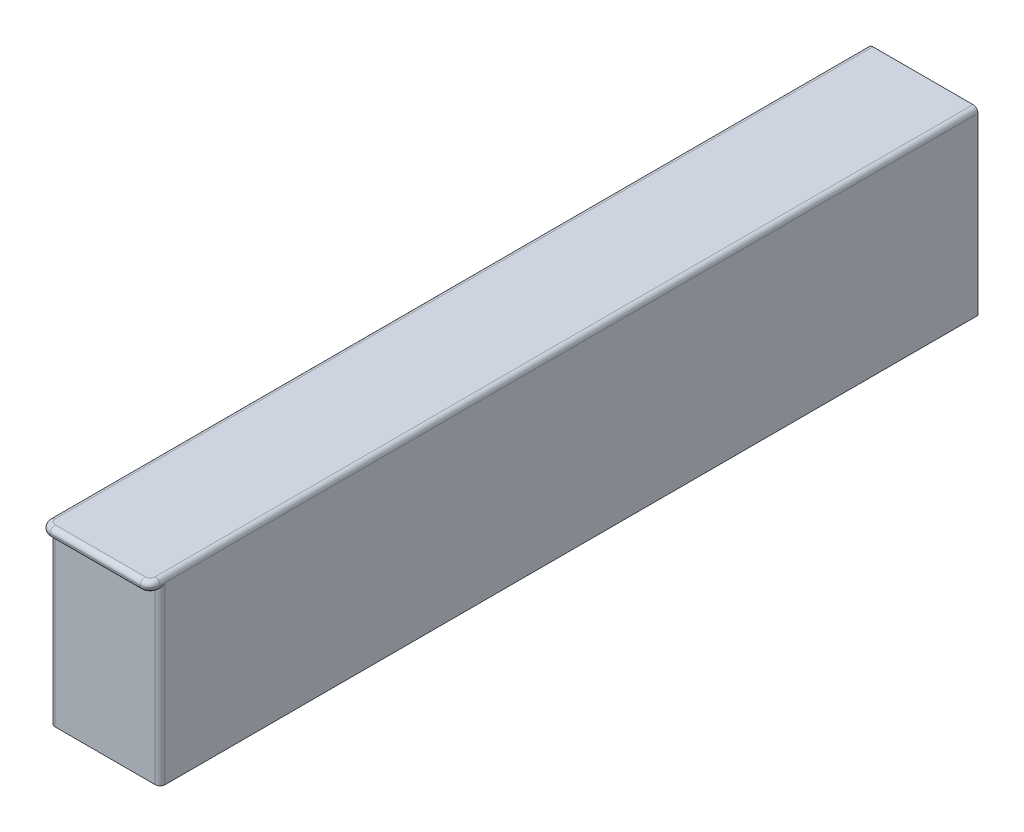
ISO-10303-21;
HEADER;
FILE_DESCRIPTION(('STEP AP214'),'2;1');
FILE_NAME('part.step','',(''),(''),'','','');
FILE_SCHEMA(('AUTOMOTIVE_DESIGN { 1 0 10303 214 1 1 1 1 }'));
ENDSEC;
DATA;
#1=APPLICATION_CONTEXT('core data for automotive mechanical design processes');
#2=APPLICATION_PROTOCOL_DEFINITION('international standard','automotive_design',2000,#1);
#3=PRODUCT_CONTEXT('',#1,'mechanical');
#4=PRODUCT('Part','Part','',(#3));
#5=PRODUCT_RELATED_PRODUCT_CATEGORY('part','',(#4));
#6=PRODUCT_DEFINITION_FORMATION('','',#4);
#7=PRODUCT_DEFINITION_CONTEXT('part definition',#1,'design');
#8=PRODUCT_DEFINITION('design','',#6,#7);
#9=PRODUCT_DEFINITION_SHAPE('','',#8);
#10=(LENGTH_UNIT() NAMED_UNIT(*) SI_UNIT(.MILLI.,.METRE.));
#11=(NAMED_UNIT(*) PLANE_ANGLE_UNIT() SI_UNIT($,.RADIAN.));
#12=(NAMED_UNIT(*) SI_UNIT($,.STERADIAN.) SOLID_ANGLE_UNIT());
#13=UNCERTAINTY_MEASURE_WITH_UNIT(LENGTH_MEASURE(1.E-05),#10,'distance_accuracy_value','');
#14=(GEOMETRIC_REPRESENTATION_CONTEXT(3) GLOBAL_UNCERTAINTY_ASSIGNED_CONTEXT((#13)) GLOBAL_UNIT_ASSIGNED_CONTEXT((#10,
#11,#12)) REPRESENTATION_CONTEXT('',''));
#15=CARTESIAN_POINT('',(0.,0.,0.));
#16=DIRECTION('',(0.,0.,1.));
#17=DIRECTION('',(1.,0.,0.));
#18=AXIS2_PLACEMENT_3D('',#15,#16,#17);
#19=CARTESIAN_POINT('',(-11.,36.,81.75));
#20=DIRECTION('',(0.,0.,-1.));
#21=DIRECTION('',(-1.,0.,0.));
#22=AXIS2_PLACEMENT_3D('',#19,#20,#21);
#23=PLANE('',#22);
#24=DIRECTION('',(1.,0.,0.));
#25=VECTOR('',#24,1.);
#26=CARTESIAN_POINT('',(-11.,34.,81.75));
#27=LINE('',#26,#25);
#28=CARTESIAN_POINT('',(-10.,34.,81.75));
#29=VERTEX_POINT('',#28);
#30=CARTESIAN_POINT('',(10.,34.,81.75));
#31=VERTEX_POINT('',#30);
#32=EDGE_CURVE('E225',#29,#31,#27,.T.);
#33=ORIENTED_EDGE('',*,*,#32,.F.);
#34=DIRECTION('',(0.,-1.,0.));
#35=VECTOR('',#34,1.);
#36=CARTESIAN_POINT('',(-10.,0.,81.75));
#37=LINE('',#36,#35);
#38=CARTESIAN_POINT('',(-10.,0.,81.75));
#39=VERTEX_POINT('',#38);
#40=EDGE_CURVE('E160',#29,#39,#37,.T.);
#41=ORIENTED_EDGE('',*,*,#40,.T.);
#42=DIRECTION('',(1.,0.,0.));
#43=VECTOR('',#42,1.);
#44=CARTESIAN_POINT('',(-11.,0.,81.75));
#45=LINE('',#44,#43);
#46=CARTESIAN_POINT('',(10.,0.,81.75));
#47=VERTEX_POINT('',#46);
#48=EDGE_CURVE('E226',#39,#47,#45,.T.);
#49=ORIENTED_EDGE('',*,*,#48,.T.);
#50=DIRECTION('',(0.,-1.,0.));
#51=VECTOR('',#50,1.);
#52=CARTESIAN_POINT('',(10.,36.,81.75));
#53=LINE('',#52,#51);
#54=EDGE_CURVE('E247',#47,#31,#53,.F.);
#55=ORIENTED_EDGE('',*,*,#54,.T.);
#56=EDGE_LOOP('',(#33,#41,#49,#55));
#57=FACE_BOUND('',#56,.T.);
#58=ADVANCED_FACE('F45',(#57),#23,.F.);
#59=CARTESIAN_POINT('',(-10.,36.,80.75));
#60=DIRECTION('',(0.,1.,0.));
#61=DIRECTION('',(0.,0.,1.));
#62=AXIS2_PLACEMENT_3D('',#59,#60,#61);
#63=CYLINDRICAL_SURFACE('',#62,1.);
#64=ORIENTED_EDGE('',*,*,#40,.F.);
#65=CARTESIAN_POINT('',(-10.,35.,80.75));
#66=DIRECTION('',(0.,-0.707106781186547,-0.707106781186547));
#67=DIRECTION('',(0.,0.707106781186547,-0.707106781186547));
#68=AXIS2_PLACEMENT_3D('',#65,#66,#67);
#69=ELLIPSE('',#68,1.41421356237309,1.);
#70=CARTESIAN_POINT('',(-11.,35.,80.75));
#71=VERTEX_POINT('',#70);
#72=EDGE_CURVE('E55',#29,#71,#69,.T.);
#73=ORIENTED_EDGE('',*,*,#72,.T.);
#74=DIRECTION('',(0.,-1.,0.));
#75=VECTOR('',#74,1.);
#76=CARTESIAN_POINT('',(-11.,36.,80.75));
#77=LINE('',#76,#75);
#78=CARTESIAN_POINT('',(-11.,0.,80.75));
#79=VERTEX_POINT('',#78);
#80=EDGE_CURVE('E145',#79,#71,#77,.F.);
#81=ORIENTED_EDGE('',*,*,#80,.F.);
#82=CARTESIAN_POINT('',(-10.,0.,80.75));
#83=DIRECTION('',(0.,1.,0.));
#84=DIRECTION('',(0.,0.,1.));
#85=AXIS2_PLACEMENT_3D('',#82,#83,#84);
#86=CIRCLE('',#85,1.);
#87=EDGE_CURVE('E156',#39,#79,#86,.F.);
#88=ORIENTED_EDGE('',*,*,#87,.F.);
#89=EDGE_LOOP('',(#64,#73,#81,#88));
#90=FACE_BOUND('',#89,.T.);
#91=ADVANCED_FACE('F159',(#90),#63,.T.);
#92=CARTESIAN_POINT('',(10.,36.,80.75));
#93=DIRECTION('',(0.,-1.,0.));
#94=DIRECTION('',(0.,0.,-1.));
#95=AXIS2_PLACEMENT_3D('',#92,#93,#94);
#96=CYLINDRICAL_SURFACE('',#95,1.);
#97=DIRECTION('',(0.,-1.,0.));
#98=VECTOR('',#97,1.);
#99=CARTESIAN_POINT('',(11.,36.,80.75));
#100=LINE('',#99,#98);
#101=CARTESIAN_POINT('',(11.,35.,80.75));
#102=VERTEX_POINT('',#101);
#103=CARTESIAN_POINT('',(11.,0.,80.75));
#104=VERTEX_POINT('',#103);
#105=EDGE_CURVE('E155',#102,#104,#100,.T.);
#106=ORIENTED_EDGE('',*,*,#105,.F.);
#107=CARTESIAN_POINT('',(10.,35.,80.75));
#108=DIRECTION('',(0.,-0.707106781186547,-0.707106781186547));
#109=DIRECTION('',(0.,0.707106781186547,-0.707106781186547));
#110=AXIS2_PLACEMENT_3D('',#107,#108,#109);
#111=ELLIPSE('',#110,1.41421356237309,1.);
#112=EDGE_CURVE('E11',#102,#31,#111,.T.);
#113=ORIENTED_EDGE('',*,*,#112,.T.);
#114=ORIENTED_EDGE('',*,*,#54,.F.);
#115=CARTESIAN_POINT('',(10.,0.,80.75));
#116=DIRECTION('',(0.,1.,0.));
#117=DIRECTION('',(0.,0.,1.));
#118=AXIS2_PLACEMENT_3D('',#115,#116,#117);
#119=CIRCLE('',#118,1.);
#120=EDGE_CURVE('E250',#104,#47,#119,.F.);
#121=ORIENTED_EDGE('',*,*,#120,.F.);
#122=EDGE_LOOP('',(#106,#113,#114,#121));
#123=FACE_BOUND('',#122,.T.);
#124=ADVANCED_FACE('F306',(#123),#96,.T.);
#125=CARTESIAN_POINT('',(11.,36.,81.75));
#126=DIRECTION('',(-1.,0.,0.));
#127=DIRECTION('',(0.,0.,1.));
#128=AXIS2_PLACEMENT_3D('',#125,#126,#127);
#129=PLANE('',#128);
#130=DIRECTION('',(0.,-1.,0.));
#131=VECTOR('',#130,1.);
#132=CARTESIAN_POINT('',(11.,36.,-81.75));
#133=LINE('',#132,#131);
#134=CARTESIAN_POINT('',(11.,35.,-81.75));
#135=VERTEX_POINT('',#134);
#136=CARTESIAN_POINT('',(11.,0.,-81.75));
#137=VERTEX_POINT('',#136);
#138=EDGE_CURVE('E245',#135,#137,#133,.T.);
#139=ORIENTED_EDGE('',*,*,#138,.F.);
#140=DIRECTION('',(0.,0.,-1.));
#141=VECTOR('',#140,1.);
#142=CARTESIAN_POINT('',(11.,35.,81.75));
#143=LINE('',#142,#141);
#144=EDGE_CURVE('E170',#135,#102,#143,.F.);
#145=ORIENTED_EDGE('',*,*,#144,.T.);
#146=ORIENTED_EDGE('',*,*,#105,.T.);
#147=DIRECTION('',(0.,0.,-1.));
#148=VECTOR('',#147,1.);
#149=CARTESIAN_POINT('',(11.,0.,81.75));
#150=LINE('',#149,#148);
#151=EDGE_CURVE('E231',#104,#137,#150,.T.);
#152=ORIENTED_EDGE('',*,*,#151,.T.);
#153=EDGE_LOOP('',(#139,#145,#146,#152));
#154=FACE_BOUND('',#153,.T.);
#155=ADVANCED_FACE('F272',(#154),#129,.F.);
#156=CARTESIAN_POINT('',(-11.,36.,-81.75));
#157=DIRECTION('',(0.,0.,-1.));
#158=DIRECTION('',(-1.,0.,0.));
#159=AXIS2_PLACEMENT_3D('',#156,#157,#158);
#160=PLANE('',#159);
#161=DIRECTION('',(1.,0.,0.));
#162=VECTOR('',#161,1.);
#163=CARTESIAN_POINT('',(-11.,36.,-81.75));
#164=LINE('',#163,#162);
#165=CARTESIAN_POINT('',(-10.,36.,-81.75));
#166=VERTEX_POINT('',#165);
#167=CARTESIAN_POINT('',(10.,36.,-81.75));
#168=VERTEX_POINT('',#167);
#169=EDGE_CURVE('E234',#166,#168,#164,.T.);
#170=ORIENTED_EDGE('',*,*,#169,.T.);
#171=CARTESIAN_POINT('',(10.,35.,-81.75));
#172=DIRECTION('',(0.,0.,-1.));
#173=DIRECTION('',(-1.,0.,0.));
#174=AXIS2_PLACEMENT_3D('',#171,#172,#173);
#175=CIRCLE('',#174,1.);
#176=EDGE_CURVE('E175',#168,#135,#175,.T.);
#177=ORIENTED_EDGE('',*,*,#176,.T.);
#178=ORIENTED_EDGE('',*,*,#138,.T.);
#179=DIRECTION('',(1.,0.,0.));
#180=VECTOR('',#179,1.);
#181=CARTESIAN_POINT('',(-11.,0.,-81.75));
#182=LINE('',#181,#180);
#183=CARTESIAN_POINT('',(-11.,0.,-81.75));
#184=VERTEX_POINT('',#183);
#185=EDGE_CURVE('E240',#184,#137,#182,.T.);
#186=ORIENTED_EDGE('',*,*,#185,.F.);
#187=DIRECTION('',(0.,-1.,0.));
#188=VECTOR('',#187,1.);
#189=CARTESIAN_POINT('',(-11.,36.,-81.75));
#190=LINE('',#189,#188);
#191=CARTESIAN_POINT('',(-11.,35.,-81.75));
#192=VERTEX_POINT('',#191);
#193=EDGE_CURVE('E236',#192,#184,#190,.T.);
#194=ORIENTED_EDGE('',*,*,#193,.F.);
#195=CARTESIAN_POINT('',(-10.,35.,-81.75));
#196=DIRECTION('',(0.,0.,-1.));
#197=DIRECTION('',(-1.,0.,0.));
#198=AXIS2_PLACEMENT_3D('',#195,#196,#197);
#199=CIRCLE('',#198,1.);
#200=EDGE_CURVE('E169',#192,#166,#199,.T.);
#201=ORIENTED_EDGE('',*,*,#200,.T.);
#202=EDGE_LOOP('',(#170,#177,#178,#186,#194,#201));
#203=FACE_BOUND('',#202,.T.);
#204=ADVANCED_FACE('F265',(#203),#160,.T.);
#205=CARTESIAN_POINT('',(-11.,36.,81.75));
#206=DIRECTION('',(-1.,0.,0.));
#207=DIRECTION('',(0.,0.,1.));
#208=AXIS2_PLACEMENT_3D('',#205,#206,#207);
#209=PLANE('',#208);
#210=ORIENTED_EDGE('',*,*,#80,.T.);
#211=DIRECTION('',(0.,0.,-1.));
#212=VECTOR('',#211,1.);
#213=CARTESIAN_POINT('',(-11.,35.,81.75));
#214=LINE('',#213,#212);
#215=EDGE_CURVE('E149',#71,#192,#214,.T.);
#216=ORIENTED_EDGE('',*,*,#215,.T.);
#217=ORIENTED_EDGE('',*,*,#193,.T.);
#218=DIRECTION('',(0.,0.,-1.));
#219=VECTOR('',#218,1.);
#220=CARTESIAN_POINT('',(-11.,0.,81.75));
#221=LINE('',#220,#219);
#222=EDGE_CURVE('E152',#79,#184,#221,.T.);
#223=ORIENTED_EDGE('',*,*,#222,.F.);
#224=EDGE_LOOP('',(#210,#216,#217,#223));
#225=FACE_BOUND('',#224,.T.);
#226=ADVANCED_FACE('F147',(#225),#209,.T.);
#227=CARTESIAN_POINT('',(0.,36.,0.));
#228=DIRECTION('',(0.,1.,0.));
#229=DIRECTION('',(0.,0.,1.));
#230=AXIS2_PLACEMENT_3D('',#227,#228,#229);
#231=PLANE('',#230);
#232=CARTESIAN_POINT('',(9.,36.,81.75));
#233=DIRECTION('',(0.,1.,0.));
#234=DIRECTION('',(0.,0.,1.));
#235=AXIS2_PLACEMENT_3D('',#232,#233,#234);
#236=CIRCLE('',#235,1.);
#237=CARTESIAN_POINT('',(9.,36.,82.75));
#238=VERTEX_POINT('',#237);
#239=CARTESIAN_POINT('',(10.,36.,81.75));
#240=VERTEX_POINT('',#239);
#241=EDGE_CURVE('E258',#238,#240,#236,.T.);
#242=ORIENTED_EDGE('',*,*,#241,.T.);
#243=DIRECTION('',(0.,0.,-1.));
#244=VECTOR('',#243,1.);
#245=CARTESIAN_POINT('',(10.,36.,-81.75));
#246=LINE('',#245,#244);
#247=EDGE_CURVE('E260',#240,#168,#246,.T.);
#248=ORIENTED_EDGE('',*,*,#247,.T.);
#249=ORIENTED_EDGE('',*,*,#169,.F.);
#250=DIRECTION('',(0.,0.,-1.));
#251=VECTOR('',#250,1.);
#252=CARTESIAN_POINT('',(-10.,36.,0.));
#253=LINE('',#252,#251);
#254=CARTESIAN_POINT('',(-10.,36.,81.75));
#255=VERTEX_POINT('',#254);
#256=EDGE_CURVE('E254',#166,#255,#253,.F.);
#257=ORIENTED_EDGE('',*,*,#256,.T.);
#258=CARTESIAN_POINT('',(-9.,36.,81.75));
#259=DIRECTION('',(0.,1.,0.));
#260=DIRECTION('',(0.,0.,1.));
#261=AXIS2_PLACEMENT_3D('',#258,#259,#260);
#262=CIRCLE('',#261,1.);
#263=CARTESIAN_POINT('',(-9.,36.,82.75));
#264=VERTEX_POINT('',#263);
#265=EDGE_CURVE('E223',#255,#264,#262,.T.);
#266=ORIENTED_EDGE('',*,*,#265,.T.);
#267=DIRECTION('',(1.,0.,0.));
#268=VECTOR('',#267,1.);
#269=CARTESIAN_POINT('',(0.,36.,82.75));
#270=LINE('',#269,#268);
#271=EDGE_CURVE('E219',#264,#238,#270,.T.);
#272=ORIENTED_EDGE('',*,*,#271,.T.);
#273=EDGE_LOOP('',(#242,#248,#249,#257,#266,#272));
#274=FACE_BOUND('',#273,.T.);
#275=ADVANCED_FACE('F286',(#274),#231,.T.);
#276=CARTESIAN_POINT('',(0.,0.,0.));
#277=DIRECTION('',(0.,1.,0.));
#278=DIRECTION('',(0.,0.,1.));
#279=AXIS2_PLACEMENT_3D('',#276,#277,#278);
#280=PLANE('',#279);
#281=ORIENTED_EDGE('',*,*,#48,.F.);
#282=ORIENTED_EDGE('',*,*,#87,.T.);
#283=ORIENTED_EDGE('',*,*,#222,.T.);
#284=ORIENTED_EDGE('',*,*,#185,.T.);
#285=ORIENTED_EDGE('',*,*,#151,.F.);
#286=ORIENTED_EDGE('',*,*,#120,.T.);
#287=EDGE_LOOP('',(#281,#282,#283,#284,#285,#286));
#288=FACE_BOUND('',#287,.T.);
#289=ADVANCED_FACE('F288',(#288),#280,.F.);
#290=CARTESIAN_POINT('',(0.,34.,0.));
#291=DIRECTION('',(0.,1.,0.));
#292=DIRECTION('',(0.,0.,1.));
#293=AXIS2_PLACEMENT_3D('',#290,#291,#292);
#294=PLANE('',#293);
#295=DIRECTION('',(1.,0.,0.));
#296=VECTOR('',#295,1.);
#297=CARTESIAN_POINT('',(-9.,34.,82.75));
#298=LINE('',#297,#296);
#299=CARTESIAN_POINT('',(9.,34.,82.75));
#300=VERTEX_POINT('',#299);
#301=CARTESIAN_POINT('',(-9.,34.,82.75));
#302=VERTEX_POINT('',#301);
#303=EDGE_CURVE('E64',#300,#302,#298,.F.);
#304=ORIENTED_EDGE('',*,*,#303,.T.);
#305=CARTESIAN_POINT('',(-9.,34.,81.75));
#306=DIRECTION('',(0.,1.,0.));
#307=DIRECTION('',(0.,0.,1.));
#308=AXIS2_PLACEMENT_3D('',#305,#306,#307);
#309=CIRCLE('',#308,1.);
#310=EDGE_CURVE('E161',#302,#29,#309,.F.);
#311=ORIENTED_EDGE('',*,*,#310,.T.);
#312=ORIENTED_EDGE('',*,*,#32,.T.);
#313=CARTESIAN_POINT('',(9.,34.,81.75));
#314=DIRECTION('',(0.,1.,0.));
#315=DIRECTION('',(0.,0.,1.));
#316=AXIS2_PLACEMENT_3D('',#313,#314,#315);
#317=CIRCLE('',#316,1.);
#318=EDGE_CURVE('E172',#31,#300,#317,.F.);
#319=ORIENTED_EDGE('',*,*,#318,.T.);
#320=EDGE_LOOP('',(#304,#311,#312,#319));
#321=FACE_BOUND('',#320,.T.);
#322=ADVANCED_FACE('F295',(#321),#294,.F.);
#323=CARTESIAN_POINT('',(-10.,35.,81.75));
#324=DIRECTION('',(0.,0.,-1.));
#325=DIRECTION('',(-1.,0.,0.));
#326=AXIS2_PLACEMENT_3D('',#323,#324,#325);
#327=CYLINDRICAL_SURFACE('',#326,1.);
#328=DIRECTION('',(0.,0.,1.));
#329=VECTOR('',#328,1.);
#330=CARTESIAN_POINT('',(-11.,35.,81.75));
#331=LINE('',#330,#329);
#332=CARTESIAN_POINT('',(-11.,35.,81.75));
#333=VERTEX_POINT('',#332);
#334=EDGE_CURVE('E163',#71,#333,#331,.T.);
#335=ORIENTED_EDGE('',*,*,#334,.F.);
#336=ORIENTED_EDGE('',*,*,#72,.F.);
#337=CARTESIAN_POINT('',(-10.,35.,81.75));
#338=DIRECTION('',(0.,0.,1.));
#339=DIRECTION('',(1.,0.,0.));
#340=AXIS2_PLACEMENT_3D('',#337,#338,#339);
#341=CIRCLE('',#340,1.);
#342=EDGE_CURVE('E49',#333,#29,#341,.T.);
#343=ORIENTED_EDGE('',*,*,#342,.F.);
#344=EDGE_LOOP('',(#335,#336,#343));
#345=FACE_BOUND('',#344,.T.);
#346=ADVANCED_FACE('F47',(#345),#327,.T.);
#347=CARTESIAN_POINT('',(-9.,35.,81.75));
#348=DIRECTION('',(0.,1.,0.));
#349=DIRECTION('',(0.,0.,1.));
#350=AXIS2_PLACEMENT_3D('',#347,#348,#349);
#351=DEGENERATE_TOROIDAL_SURFACE('',#350,1.,1.,.T.);
#352=ORIENTED_EDGE('',*,*,#342,.T.);
#353=ORIENTED_EDGE('',*,*,#310,.F.);
#354=CARTESIAN_POINT('',(-9.,35.,82.75));
#355=DIRECTION('',(1.,0.,0.));
#356=DIRECTION('',(0.,0.,-1.));
#357=AXIS2_PLACEMENT_3D('',#354,#355,#356);
#358=CIRCLE('',#357,1.);
#359=CARTESIAN_POINT('',(-9.,35.,83.75));
#360=VERTEX_POINT('',#359);
#361=EDGE_CURVE('E80',#360,#302,#358,.T.);
#362=ORIENTED_EDGE('',*,*,#361,.F.);
#363=CARTESIAN_POINT('',(-9.,35.,81.75));
#364=DIRECTION('',(0.,1.,0.));
#365=DIRECTION('',(0.,0.,1.));
#366=AXIS2_PLACEMENT_3D('',#363,#364,#365);
#367=CIRCLE('',#366,2.);
#368=EDGE_CURVE('E208',#333,#360,#367,.T.);
#369=ORIENTED_EDGE('',*,*,#368,.F.);
#370=EDGE_LOOP('',(#352,#353,#362,#369));
#371=FACE_BOUND('',#370,.T.);
#372=ADVANCED_FACE('F224',(#371),#351,.T.);
#373=CARTESIAN_POINT('',(-10.,35.,81.75));
#374=DIRECTION('',(0.,0.,-1.));
#375=DIRECTION('',(-1.,0.,0.));
#376=AXIS2_PLACEMENT_3D('',#373,#374,#375);
#377=CYLINDRICAL_SURFACE('',#376,1.);
#378=ORIENTED_EDGE('',*,*,#215,.F.);
#379=ORIENTED_EDGE('',*,*,#334,.T.);
#380=CARTESIAN_POINT('',(-10.,35.,81.75));
#381=DIRECTION('',(0.,0.,1.));
#382=DIRECTION('',(1.,0.,0.));
#383=AXIS2_PLACEMENT_3D('',#380,#381,#382);
#384=CIRCLE('',#383,1.);
#385=EDGE_CURVE('E205',#255,#333,#384,.T.);
#386=ORIENTED_EDGE('',*,*,#385,.F.);
#387=ORIENTED_EDGE('',*,*,#256,.F.);
#388=ORIENTED_EDGE('',*,*,#200,.F.);
#389=EDGE_LOOP('',(#378,#379,#386,#387,#388));
#390=FACE_BOUND('',#389,.T.);
#391=ADVANCED_FACE('F167',(#390),#377,.T.);
#392=CARTESIAN_POINT('',(-11.,35.,82.75));
#393=DIRECTION('',(-1.,0.,0.));
#394=DIRECTION('',(0.,0.,1.));
#395=AXIS2_PLACEMENT_3D('',#392,#393,#394);
#396=CYLINDRICAL_SURFACE('',#395,1.);
#397=ORIENTED_EDGE('',*,*,#361,.T.);
#398=ORIENTED_EDGE('',*,*,#303,.F.);
#399=CARTESIAN_POINT('',(9.,35.,82.75));
#400=DIRECTION('',(1.,0.,0.));
#401=DIRECTION('',(0.,0.,-1.));
#402=AXIS2_PLACEMENT_3D('',#399,#400,#401);
#403=CIRCLE('',#402,1.);
#404=CARTESIAN_POINT('',(9.,35.,83.75));
#405=VERTEX_POINT('',#404);
#406=EDGE_CURVE('E202',#405,#300,#403,.T.);
#407=ORIENTED_EDGE('',*,*,#406,.F.);
#408=DIRECTION('',(1.,0.,0.));
#409=VECTOR('',#408,1.);
#410=CARTESIAN_POINT('',(9.,35.,83.75));
#411=LINE('',#410,#409);
#412=EDGE_CURVE('E199',#360,#405,#411,.T.);
#413=ORIENTED_EDGE('',*,*,#412,.F.);
#414=EDGE_LOOP('',(#397,#398,#407,#413));
#415=FACE_BOUND('',#414,.T.);
#416=ADVANCED_FACE('F212',(#415),#396,.T.);
#417=CARTESIAN_POINT('',(-9.,35.,81.75));
#418=DIRECTION('',(0.,1.,0.));
#419=DIRECTION('',(0.,0.,1.));
#420=AXIS2_PLACEMENT_3D('',#417,#418,#419);
#421=DEGENERATE_TOROIDAL_SURFACE('',#420,1.,1.,.T.);
#422=ORIENTED_EDGE('',*,*,#385,.T.);
#423=ORIENTED_EDGE('',*,*,#368,.T.);
#424=CARTESIAN_POINT('',(-9.,35.,82.75));
#425=DIRECTION('',(1.,0.,0.));
#426=DIRECTION('',(0.,0.,-1.));
#427=AXIS2_PLACEMENT_3D('',#424,#425,#426);
#428=CIRCLE('',#427,1.);
#429=EDGE_CURVE('E196',#264,#360,#428,.T.);
#430=ORIENTED_EDGE('',*,*,#429,.F.);
#431=ORIENTED_EDGE('',*,*,#265,.F.);
#432=EDGE_LOOP('',(#422,#423,#430,#431));
#433=FACE_BOUND('',#432,.T.);
#434=ADVANCED_FACE('F222',(#433),#421,.T.);
#435=CARTESIAN_POINT('',(9.,35.,81.75));
#436=DIRECTION('',(0.,1.,0.));
#437=DIRECTION('',(0.,0.,1.));
#438=AXIS2_PLACEMENT_3D('',#435,#436,#437);
#439=DEGENERATE_TOROIDAL_SURFACE('',#438,1.,1.,.T.);
#440=ORIENTED_EDGE('',*,*,#406,.T.);
#441=ORIENTED_EDGE('',*,*,#318,.F.);
#442=CARTESIAN_POINT('',(10.,35.,81.75));
#443=DIRECTION('',(0.,0.,-1.));
#444=DIRECTION('',(-1.,0.,0.));
#445=AXIS2_PLACEMENT_3D('',#442,#443,#444);
#446=CIRCLE('',#445,1.);
#447=CARTESIAN_POINT('',(11.,35.,81.75));
#448=VERTEX_POINT('',#447);
#449=EDGE_CURVE('E193',#448,#31,#446,.T.);
#450=ORIENTED_EDGE('',*,*,#449,.F.);
#451=CARTESIAN_POINT('',(9.,35.,81.75));
#452=DIRECTION('',(0.,1.,0.));
#453=DIRECTION('',(0.,0.,1.));
#454=AXIS2_PLACEMENT_3D('',#451,#452,#453);
#455=CIRCLE('',#454,2.);
#456=EDGE_CURVE('E190',#405,#448,#455,.T.);
#457=ORIENTED_EDGE('',*,*,#456,.F.);
#458=EDGE_LOOP('',(#440,#441,#450,#457));
#459=FACE_BOUND('',#458,.T.);
#460=ADVANCED_FACE('F281',(#459),#439,.T.);
#461=CARTESIAN_POINT('',(0.,35.,82.75));
#462=DIRECTION('',(1.,0.,0.));
#463=DIRECTION('',(0.,0.,-1.));
#464=AXIS2_PLACEMENT_3D('',#461,#462,#463);
#465=CYLINDRICAL_SURFACE('',#464,1.);
#466=ORIENTED_EDGE('',*,*,#429,.T.);
#467=ORIENTED_EDGE('',*,*,#412,.T.);
#468=CARTESIAN_POINT('',(9.,35.,82.75));
#469=DIRECTION('',(1.,0.,0.));
#470=DIRECTION('',(0.,0.,-1.));
#471=AXIS2_PLACEMENT_3D('',#468,#469,#470);
#472=CIRCLE('',#471,1.);
#473=EDGE_CURVE('E187',#238,#405,#472,.T.);
#474=ORIENTED_EDGE('',*,*,#473,.F.);
#475=ORIENTED_EDGE('',*,*,#271,.F.);
#476=EDGE_LOOP('',(#466,#467,#474,#475));
#477=FACE_BOUND('',#476,.T.);
#478=ADVANCED_FACE('F218',(#477),#465,.T.);
#479=CARTESIAN_POINT('',(10.,35.,81.75));
#480=DIRECTION('',(0.,0.,-1.));
#481=DIRECTION('',(-1.,0.,0.));
#482=AXIS2_PLACEMENT_3D('',#479,#480,#481);
#483=CYLINDRICAL_SURFACE('',#482,1.);
#484=ORIENTED_EDGE('',*,*,#449,.T.);
#485=ORIENTED_EDGE('',*,*,#112,.F.);
#486=DIRECTION('',(0.,0.,-1.));
#487=VECTOR('',#486,1.);
#488=CARTESIAN_POINT('',(11.,35.,81.75));
#489=LINE('',#488,#487);
#490=EDGE_CURVE('E184',#448,#102,#489,.T.);
#491=ORIENTED_EDGE('',*,*,#490,.F.);
#492=EDGE_LOOP('',(#484,#485,#491));
#493=FACE_BOUND('',#492,.T.);
#494=ADVANCED_FACE('F278',(#493),#483,.T.);
#495=CARTESIAN_POINT('',(9.,35.,81.75));
#496=DIRECTION('',(0.,1.,0.));
#497=DIRECTION('',(0.,0.,1.));
#498=AXIS2_PLACEMENT_3D('',#495,#496,#497);
#499=DEGENERATE_TOROIDAL_SURFACE('',#498,1.,1.,.T.);
#500=ORIENTED_EDGE('',*,*,#473,.T.);
#501=ORIENTED_EDGE('',*,*,#456,.T.);
#502=CARTESIAN_POINT('',(10.,35.,81.75));
#503=DIRECTION('',(0.,0.,-1.));
#504=DIRECTION('',(-1.,0.,0.));
#505=AXIS2_PLACEMENT_3D('',#502,#503,#504);
#506=CIRCLE('',#505,1.);
#507=EDGE_CURVE('E181',#240,#448,#506,.T.);
#508=ORIENTED_EDGE('',*,*,#507,.F.);
#509=ORIENTED_EDGE('',*,*,#241,.F.);
#510=EDGE_LOOP('',(#500,#501,#508,#509));
#511=FACE_BOUND('',#510,.T.);
#512=ADVANCED_FACE('F283',(#511),#499,.T.);
#513=CARTESIAN_POINT('',(10.,35.,0.));
#514=DIRECTION('',(0.,0.,1.));
#515=DIRECTION('',(1.,0.,0.));
#516=AXIS2_PLACEMENT_3D('',#513,#514,#515);
#517=CYLINDRICAL_SURFACE('',#516,1.);
#518=ORIENTED_EDGE('',*,*,#490,.T.);
#519=ORIENTED_EDGE('',*,*,#144,.F.);
#520=ORIENTED_EDGE('',*,*,#176,.F.);
#521=ORIENTED_EDGE('',*,*,#247,.F.);
#522=ORIENTED_EDGE('',*,*,#507,.T.);
#523=EDGE_LOOP('',(#518,#519,#520,#521,#522));
#524=FACE_BOUND('',#523,.T.);
#525=ADVANCED_FACE('F274',(#524),#517,.T.);
#526=CLOSED_SHELL('',(#58,#91,#124,#155,#204,#226,#275,#289,#322,#346,#372,#391,#416,#434,#460,
#478,#494,#512,#525));
#527=MANIFOLD_SOLID_BREP('B2',#526);
#528=ADVANCED_BREP_SHAPE_REPRESENTATION('',(#18,#527),#14);
#529=SHAPE_DEFINITION_REPRESENTATION(#9,#528);
ENDSEC;
END-ISO-10303-21;
